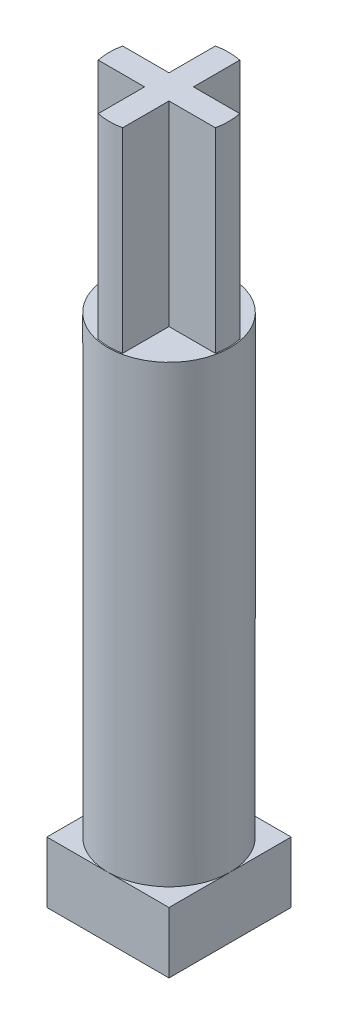
ISO-10303-21;
HEADER;
FILE_DESCRIPTION(('STEP AP214'),'2;1');
FILE_NAME('part.step','',(''),(''),'','','');
FILE_SCHEMA(('AUTOMOTIVE_DESIGN { 1 0 10303 214 1 1 1 1 }'));
ENDSEC;
DATA;
#1=APPLICATION_CONTEXT('core data for automotive mechanical design processes');
#2=APPLICATION_PROTOCOL_DEFINITION('international standard','automotive_design',2000,#1);
#3=PRODUCT_CONTEXT('',#1,'mechanical');
#4=PRODUCT('Part','Part','',(#3));
#5=PRODUCT_RELATED_PRODUCT_CATEGORY('part','',(#4));
#6=PRODUCT_DEFINITION_FORMATION('','',#4);
#7=PRODUCT_DEFINITION_CONTEXT('part definition',#1,'design');
#8=PRODUCT_DEFINITION('design','',#6,#7);
#9=PRODUCT_DEFINITION_SHAPE('','',#8);
#10=(LENGTH_UNIT() NAMED_UNIT(*) SI_UNIT(.MILLI.,.METRE.));
#11=(NAMED_UNIT(*) PLANE_ANGLE_UNIT() SI_UNIT($,.RADIAN.));
#12=(NAMED_UNIT(*) SI_UNIT($,.STERADIAN.) SOLID_ANGLE_UNIT());
#13=UNCERTAINTY_MEASURE_WITH_UNIT(LENGTH_MEASURE(1.E-05),#10,'distance_accuracy_value','');
#14=(GEOMETRIC_REPRESENTATION_CONTEXT(3) GLOBAL_UNCERTAINTY_ASSIGNED_CONTEXT((#13)) GLOBAL_UNIT_ASSIGNED_CONTEXT((#10,
#11,#12)) REPRESENTATION_CONTEXT('',''));
#15=CARTESIAN_POINT('',(0.,0.,0.));
#16=DIRECTION('',(0.,0.,1.));
#17=DIRECTION('',(1.,0.,0.));
#18=AXIS2_PLACEMENT_3D('',#15,#16,#17);
#19=CARTESIAN_POINT('',(-12.5274794228426,-8.79469865117993,26.9205972098226));
#20=DIRECTION('',(0.,1.,0.));
#21=DIRECTION('',(0.,0.,1.));
#22=AXIS2_PLACEMENT_3D('',#19,#20,#21);
#23=PLANE('',#22);
#24=CARTESIAN_POINT('',(-12.5274794228426,-8.79469865117993,26.9205972098226));
#25=DIRECTION('',(0.,1.,0.));
#26=DIRECTION('',(0.,0.,1.));
#27=AXIS2_PLACEMENT_3D('',#24,#25,#26);
#28=CIRCLE('',#27,2.5);
#29=CARTESIAN_POINT('',(-12.5274794228426,-8.79469865117993,29.4205972098226));
#30=VERTEX_POINT('',#29);
#31=EDGE_CURVE('E183',#30,#30,#28,.T.);
#32=ORIENTED_EDGE('',*,*,#31,.T.);
#33=EDGE_LOOP('',(#32));
#34=FACE_BOUND('',#33,.T.);
#35=DIRECTION('',(1.,0.,0.));
#36=VECTOR('',#35,1.);
#37=CARTESIAN_POINT('',(0.,-8.79469865117993,27.4205972098226));
#38=LINE('',#37,#36);
#39=CARTESIAN_POINT('',(-12.0274794228426,-8.79469865117993,27.4205972098226));
#40=VERTEX_POINT('',#39);
#41=CARTESIAN_POINT('',(-10.1290424318003,-8.79469865117993,27.4205972098226));
#42=VERTEX_POINT('',#41);
#43=EDGE_CURVE('E234',#40,#42,#38,.T.);
#44=ORIENTED_EDGE('',*,*,#43,.F.);
#45=DIRECTION('',(0.,0.,1.));
#46=VECTOR('',#45,1.);
#47=CARTESIAN_POINT('',(-12.0274794228426,-8.79469865117993,0.));
#48=LINE('',#47,#46);
#49=CARTESIAN_POINT('',(-12.0274794228426,-8.79469865117993,29.3190342008649));
#50=VERTEX_POINT('',#49);
#51=EDGE_CURVE('E66',#40,#50,#48,.T.);
#52=ORIENTED_EDGE('',*,*,#51,.T.);
#53=CARTESIAN_POINT('',(-12.5274794228426,-8.79469865117993,26.9205972098226));
#54=DIRECTION('',(0.,1.,0.));
#55=DIRECTION('',(0.,0.,1.));
#56=AXIS2_PLACEMENT_3D('',#53,#54,#55);
#57=CIRCLE('',#56,2.45);
#58=CARTESIAN_POINT('',(-13.0274794228426,-8.79469865117993,29.3190342008649));
#59=VERTEX_POINT('',#58);
#60=EDGE_CURVE('E71',#59,#50,#57,.T.);
#61=ORIENTED_EDGE('',*,*,#60,.F.);
#62=DIRECTION('',(0.,0.,1.));
#63=VECTOR('',#62,1.);
#64=CARTESIAN_POINT('',(-13.0274794228426,-8.79469865117993,0.));
#65=LINE('',#64,#63);
#66=CARTESIAN_POINT('',(-13.0274794228426,-8.79469865117993,27.4205972098226));
#67=VERTEX_POINT('',#66);
#68=EDGE_CURVE('E202',#67,#59,#65,.T.);
#69=ORIENTED_EDGE('',*,*,#68,.F.);
#70=DIRECTION('',(-1.,0.,0.));
#71=VECTOR('',#70,1.);
#72=CARTESIAN_POINT('',(0.,-8.79469865117993,27.4205972098226));
#73=LINE('',#72,#71);
#74=CARTESIAN_POINT('',(-14.9259164138849,-8.79469865117993,27.4205972098226));
#75=VERTEX_POINT('',#74);
#76=EDGE_CURVE('E254',#67,#75,#73,.T.);
#77=ORIENTED_EDGE('',*,*,#76,.T.);
#78=CARTESIAN_POINT('',(-14.9259164138849,-8.79469865117993,26.4205972098226));
#79=VERTEX_POINT('',#78);
#80=EDGE_CURVE('E204',#79,#75,#57,.T.);
#81=ORIENTED_EDGE('',*,*,#80,.F.);
#82=DIRECTION('',(-1.,0.,0.));
#83=VECTOR('',#82,1.);
#84=CARTESIAN_POINT('',(0.,-8.79469865117993,26.4205972098226));
#85=LINE('',#84,#83);
#86=CARTESIAN_POINT('',(-13.0274794228426,-8.79469865117993,26.4205972098226));
#87=VERTEX_POINT('',#86);
#88=EDGE_CURVE('E250',#87,#79,#85,.T.);
#89=ORIENTED_EDGE('',*,*,#88,.F.);
#90=DIRECTION('',(0.,0.,-1.));
#91=VECTOR('',#90,1.);
#92=CARTESIAN_POINT('',(-13.0274794228426,-8.79469865117993,0.));
#93=LINE('',#92,#91);
#94=CARTESIAN_POINT('',(-13.0274794228426,-8.79469865117993,24.5221602187803));
#95=VERTEX_POINT('',#94);
#96=EDGE_CURVE('E247',#87,#95,#93,.T.);
#97=ORIENTED_EDGE('',*,*,#96,.T.);
#98=CARTESIAN_POINT('',(-12.0274794228426,-8.79469865117993,24.5221602187803));
#99=VERTEX_POINT('',#98);
#100=EDGE_CURVE('E240',#99,#95,#57,.T.);
#101=ORIENTED_EDGE('',*,*,#100,.F.);
#102=DIRECTION('',(0.,0.,-1.));
#103=VECTOR('',#102,1.);
#104=CARTESIAN_POINT('',(-12.0274794228426,-8.79469865117993,0.));
#105=LINE('',#104,#103);
#106=CARTESIAN_POINT('',(-12.0274794228426,-8.79469865117993,26.4205972098226));
#107=VERTEX_POINT('',#106);
#108=EDGE_CURVE('E243',#107,#99,#105,.T.);
#109=ORIENTED_EDGE('',*,*,#108,.F.);
#110=DIRECTION('',(1.,0.,0.));
#111=VECTOR('',#110,1.);
#112=CARTESIAN_POINT('',(0.,-8.79469865117993,26.4205972098226));
#113=LINE('',#112,#111);
#114=CARTESIAN_POINT('',(-10.1290424318003,-8.79469865117993,26.4205972098226));
#115=VERTEX_POINT('',#114);
#116=EDGE_CURVE('E239',#107,#115,#113,.T.);
#117=ORIENTED_EDGE('',*,*,#116,.T.);
#118=EDGE_CURVE('E205',#42,#115,#57,.T.);
#119=ORIENTED_EDGE('',*,*,#118,.F.);
#120=EDGE_LOOP('',(#44,#52,#61,#69,#77,#81,#89,#97,#101,#109,#117,#119));
#121=FACE_BOUND('',#120,.T.);
#122=ADVANCED_FACE('F47',(#34,#121),#23,.T.);
#123=CARTESIAN_POINT('',(-12.5274794228426,-27.3946986511799,26.9205972098226));
#124=DIRECTION('',(0.,1.,0.));
#125=DIRECTION('',(0.,0.,1.));
#126=AXIS2_PLACEMENT_3D('',#123,#124,#125);
#127=PLANE('',#126);
#128=CARTESIAN_POINT('',(-12.5274794228426,-27.3946986511799,26.9205972098226));
#129=DIRECTION('',(0.,1.,0.));
#130=DIRECTION('',(0.,0.,1.));
#131=AXIS2_PLACEMENT_3D('',#128,#129,#130);
#132=CIRCLE('',#131,2.5);
#133=CARTESIAN_POINT('',(-12.5274794228426,-27.3946986511799,29.4205972098226));
#134=VERTEX_POINT('',#133);
#135=CARTESIAN_POINT('',(-10.0274794228426,-27.3946986511799,26.9205972098226));
#136=VERTEX_POINT('',#135);
#137=EDGE_CURVE('E59',#134,#136,#132,.T.);
#138=ORIENTED_EDGE('',*,*,#137,.F.);
#139=DIRECTION('',(1.,0.,0.));
#140=VECTOR('',#139,1.);
#141=CARTESIAN_POINT('',(-15.0274794228426,-27.3946986511799,29.4205972098226));
#142=LINE('',#141,#140);
#143=CARTESIAN_POINT('',(-10.0274794228426,-27.3946986511799,29.4205972098226));
#144=VERTEX_POINT('',#143);
#145=EDGE_CURVE('E311',#134,#144,#142,.T.);
#146=ORIENTED_EDGE('',*,*,#145,.T.);
#147=DIRECTION('',(0.,0.,-1.));
#148=VECTOR('',#147,1.);
#149=CARTESIAN_POINT('',(-10.0274794228426,-27.3946986511799,29.4205972098226));
#150=LINE('',#149,#148);
#151=EDGE_CURVE('E312',#144,#136,#150,.T.);
#152=ORIENTED_EDGE('',*,*,#151,.T.);
#153=EDGE_LOOP('',(#138,#146,#152));
#154=FACE_BOUND('',#153,.T.);
#155=ADVANCED_FACE('F430',(#154),#127,.T.);
#156=CARTESIAN_POINT('',(-12.5274794228426,-27.3946986511799,24.4205972098226));
#157=VERTEX_POINT('',#156);
#158=EDGE_CURVE('E11',#136,#157,#132,.T.);
#159=ORIENTED_EDGE('',*,*,#158,.F.);
#160=CARTESIAN_POINT('',(-10.0274794228426,-27.3946986511799,24.4205972098226));
#161=VERTEX_POINT('',#160);
#162=EDGE_CURVE('E310',#136,#161,#150,.T.);
#163=ORIENTED_EDGE('',*,*,#162,.T.);
#164=DIRECTION('',(1.,0.,0.));
#165=VECTOR('',#164,1.);
#166=CARTESIAN_POINT('',(-15.0274794228426,-27.3946986511799,24.4205972098226));
#167=LINE('',#166,#165);
#168=EDGE_CURVE('E316',#157,#161,#167,.T.);
#169=ORIENTED_EDGE('',*,*,#168,.F.);
#170=EDGE_LOOP('',(#159,#163,#169));
#171=FACE_BOUND('',#170,.T.);
#172=ADVANCED_FACE('F370',(#171),#127,.T.);
#173=CARTESIAN_POINT('',(-15.0274794228426,-27.3946986511799,26.9205972098226));
#174=VERTEX_POINT('',#173);
#175=EDGE_CURVE('E57',#157,#174,#132,.T.);
#176=ORIENTED_EDGE('',*,*,#175,.F.);
#177=CARTESIAN_POINT('',(-15.0274794228426,-27.3946986511799,24.4205972098226));
#178=VERTEX_POINT('',#177);
#179=EDGE_CURVE('E317',#178,#157,#167,.T.);
#180=ORIENTED_EDGE('',*,*,#179,.F.);
#181=DIRECTION('',(0.,0.,-1.));
#182=VECTOR('',#181,1.);
#183=CARTESIAN_POINT('',(-15.0274794228426,-27.3946986511799,29.4205972098226));
#184=LINE('',#183,#182);
#185=EDGE_CURVE('E321',#174,#178,#184,.T.);
#186=ORIENTED_EDGE('',*,*,#185,.F.);
#187=EDGE_LOOP('',(#176,#180,#186));
#188=FACE_BOUND('',#187,.T.);
#189=ADVANCED_FACE('F367',(#188),#127,.T.);
#190=CARTESIAN_POINT('',(-15.0274794228426,-27.3946986511799,29.4205972098226));
#191=DIRECTION('',(0.,0.,-1.));
#192=DIRECTION('',(-1.,0.,0.));
#193=AXIS2_PLACEMENT_3D('',#190,#191,#192);
#194=PLANE('',#193);
#195=DIRECTION('',(1.,0.,0.));
#196=VECTOR('',#195,1.);
#197=CARTESIAN_POINT('',(-15.0274794228426,-29.8946986511799,29.4205972098226));
#198=LINE('',#197,#196);
#199=CARTESIAN_POINT('',(-15.0274794228426,-29.8946986511799,29.4205972098226));
#200=VERTEX_POINT('',#199);
#201=CARTESIAN_POINT('',(-10.0274794228426,-29.8946986511799,29.4205972098226));
#202=VERTEX_POINT('',#201);
#203=EDGE_CURVE('E305',#200,#202,#198,.T.);
#204=ORIENTED_EDGE('',*,*,#203,.T.);
#205=DIRECTION('',(0.,-1.,0.));
#206=VECTOR('',#205,1.);
#207=CARTESIAN_POINT('',(-10.0274794228426,-27.3946986511799,29.4205972098226));
#208=LINE('',#207,#206);
#209=EDGE_CURVE('E51',#144,#202,#208,.T.);
#210=ORIENTED_EDGE('',*,*,#209,.F.);
#211=ORIENTED_EDGE('',*,*,#145,.F.);
#212=CARTESIAN_POINT('',(-15.0274794228426,-27.3946986511799,29.4205972098226));
#213=VERTEX_POINT('',#212);
#214=EDGE_CURVE('E307',#213,#134,#142,.T.);
#215=ORIENTED_EDGE('',*,*,#214,.F.);
#216=DIRECTION('',(0.,-1.,0.));
#217=VECTOR('',#216,1.);
#218=CARTESIAN_POINT('',(-15.0274794228426,-27.3946986511799,29.4205972098226));
#219=LINE('',#218,#217);
#220=EDGE_CURVE('E326',#213,#200,#219,.T.);
#221=ORIENTED_EDGE('',*,*,#220,.T.);
#222=EDGE_LOOP('',(#204,#210,#211,#215,#221));
#223=FACE_BOUND('',#222,.T.);
#224=ADVANCED_FACE('F49',(#223),#194,.F.);
#225=CARTESIAN_POINT('',(-10.0274794228426,-27.3946986511799,29.4205972098226));
#226=DIRECTION('',(-1.,0.,0.));
#227=DIRECTION('',(0.,0.,1.));
#228=AXIS2_PLACEMENT_3D('',#225,#226,#227);
#229=PLANE('',#228);
#230=DIRECTION('',(0.,0.,-1.));
#231=VECTOR('',#230,1.);
#232=CARTESIAN_POINT('',(-10.0274794228426,-29.8946986511799,29.4205972098226));
#233=LINE('',#232,#231);
#234=CARTESIAN_POINT('',(-10.0274794228426,-29.8946986511799,24.4205972098226));
#235=VERTEX_POINT('',#234);
#236=EDGE_CURVE('E330',#202,#235,#233,.T.);
#237=ORIENTED_EDGE('',*,*,#236,.T.);
#238=DIRECTION('',(0.,-1.,0.));
#239=VECTOR('',#238,1.);
#240=CARTESIAN_POINT('',(-10.0274794228426,-27.3946986511799,24.4205972098226));
#241=LINE('',#240,#239);
#242=EDGE_CURVE('E346',#161,#235,#241,.T.);
#243=ORIENTED_EDGE('',*,*,#242,.F.);
#244=ORIENTED_EDGE('',*,*,#162,.F.);
#245=ORIENTED_EDGE('',*,*,#151,.F.);
#246=ORIENTED_EDGE('',*,*,#209,.T.);
#247=EDGE_LOOP('',(#237,#243,#244,#245,#246));
#248=FACE_BOUND('',#247,.T.);
#249=ADVANCED_FACE('F453',(#248),#229,.F.);
#250=CARTESIAN_POINT('',(-15.0274794228426,-27.3946986511799,24.4205972098226));
#251=DIRECTION('',(0.,0.,-1.));
#252=DIRECTION('',(-1.,0.,0.));
#253=AXIS2_PLACEMENT_3D('',#250,#251,#252);
#254=PLANE('',#253);
#255=DIRECTION('',(1.,0.,0.));
#256=VECTOR('',#255,1.);
#257=CARTESIAN_POINT('',(-15.0274794228426,-29.8946986511799,24.4205972098226));
#258=LINE('',#257,#256);
#259=CARTESIAN_POINT('',(-15.0274794228426,-29.8946986511799,24.4205972098226));
#260=VERTEX_POINT('',#259);
#261=EDGE_CURVE('E334',#260,#235,#258,.T.);
#262=ORIENTED_EDGE('',*,*,#261,.F.);
#263=DIRECTION('',(0.,-1.,0.));
#264=VECTOR('',#263,1.);
#265=CARTESIAN_POINT('',(-15.0274794228426,-27.3946986511799,24.4205972098226));
#266=LINE('',#265,#264);
#267=EDGE_CURVE('E344',#178,#260,#266,.T.);
#268=ORIENTED_EDGE('',*,*,#267,.F.);
#269=ORIENTED_EDGE('',*,*,#179,.T.);
#270=ORIENTED_EDGE('',*,*,#168,.T.);
#271=ORIENTED_EDGE('',*,*,#242,.T.);
#272=EDGE_LOOP('',(#262,#268,#269,#270,#271));
#273=FACE_BOUND('',#272,.T.);
#274=ADVANCED_FACE('F374',(#273),#254,.T.);
#275=CARTESIAN_POINT('',(-15.0274794228426,-27.3946986511799,29.4205972098226));
#276=DIRECTION('',(-1.,0.,0.));
#277=DIRECTION('',(0.,0.,1.));
#278=AXIS2_PLACEMENT_3D('',#275,#276,#277);
#279=PLANE('',#278);
#280=DIRECTION('',(0.,0.,-1.));
#281=VECTOR('',#280,1.);
#282=CARTESIAN_POINT('',(-15.0274794228426,-29.8946986511799,29.4205972098226));
#283=LINE('',#282,#281);
#284=EDGE_CURVE('E338',#200,#260,#283,.T.);
#285=ORIENTED_EDGE('',*,*,#284,.F.);
#286=ORIENTED_EDGE('',*,*,#220,.F.);
#287=EDGE_CURVE('E322',#213,#174,#184,.T.);
#288=ORIENTED_EDGE('',*,*,#287,.T.);
#289=ORIENTED_EDGE('',*,*,#185,.T.);
#290=ORIENTED_EDGE('',*,*,#267,.T.);
#291=EDGE_LOOP('',(#285,#286,#288,#289,#290));
#292=FACE_BOUND('',#291,.T.);
#293=ADVANCED_FACE('F377',(#292),#279,.T.);
#294=EDGE_CURVE('E306',#174,#134,#132,.T.);
#295=ORIENTED_EDGE('',*,*,#294,.F.);
#296=ORIENTED_EDGE('',*,*,#287,.F.);
#297=ORIENTED_EDGE('',*,*,#214,.T.);
#298=EDGE_LOOP('',(#295,#296,#297));
#299=FACE_BOUND('',#298,.T.);
#300=ADVANCED_FACE('F438',(#299),#127,.T.);
#301=CARTESIAN_POINT('',(-12.5274794228426,-29.8946986511799,26.9205972098226));
#302=DIRECTION('',(0.,1.,0.));
#303=DIRECTION('',(0.,0.,1.));
#304=AXIS2_PLACEMENT_3D('',#301,#302,#303);
#305=PLANE('',#304);
#306=ORIENTED_EDGE('',*,*,#203,.F.);
#307=ORIENTED_EDGE('',*,*,#284,.T.);
#308=ORIENTED_EDGE('',*,*,#261,.T.);
#309=ORIENTED_EDGE('',*,*,#236,.F.);
#310=EDGE_LOOP('',(#306,#307,#308,#309));
#311=FACE_BOUND('',#310,.T.);
#312=ADVANCED_FACE('F443',(#311),#305,.F.);
#313=CARTESIAN_POINT('',(-12.5274794228426,-9.79469865117993,26.9205972098226));
#314=DIRECTION('',(0.,-1.,0.));
#315=DIRECTION('',(0.,0.,-1.));
#316=AXIS2_PLACEMENT_3D('',#313,#314,#315);
#317=CYLINDRICAL_SURFACE('',#316,2.5);
#318=ORIENTED_EDGE('',*,*,#137,.T.);
#319=ORIENTED_EDGE('',*,*,#158,.T.);
#320=ORIENTED_EDGE('',*,*,#175,.T.);
#321=ORIENTED_EDGE('',*,*,#294,.T.);
#322=EDGE_LOOP('',(#318,#319,#320,#321));
#323=FACE_BOUND('',#322,.T.);
#324=ORIENTED_EDGE('',*,*,#31,.F.);
#325=EDGE_LOOP('',(#324));
#326=FACE_BOUND('',#325,.T.);
#327=ADVANCED_FACE('F361',(#323,#326),#317,.T.);
#328=CARTESIAN_POINT('',(-12.0274794228426,-0.794698651179926,0.));
#329=DIRECTION('',(1.,0.,0.));
#330=DIRECTION('',(0.,0.,-1.));
#331=AXIS2_PLACEMENT_3D('',#328,#329,#330);
#332=PLANE('',#331);
#333=ORIENTED_EDGE('',*,*,#51,.F.);
#334=DIRECTION('',(0.,-1.,0.));
#335=VECTOR('',#334,1.);
#336=CARTESIAN_POINT('',(-12.0274794228426,-0.794698651179926,27.4205972098226));
#337=LINE('',#336,#335);
#338=CARTESIAN_POINT('',(-12.0274794228426,-0.794698651179926,27.4205972098226));
#339=VERTEX_POINT('',#338);
#340=EDGE_CURVE('E175',#339,#40,#337,.T.);
#341=ORIENTED_EDGE('',*,*,#340,.F.);
#342=DIRECTION('',(0.,0.,1.));
#343=VECTOR('',#342,1.);
#344=CARTESIAN_POINT('',(-12.0274794228426,-0.794698651179926,0.));
#345=LINE('',#344,#343);
#346=CARTESIAN_POINT('',(-12.0274794228426,-0.794698651179926,29.3190342008649));
#347=VERTEX_POINT('',#346);
#348=EDGE_CURVE('E179',#339,#347,#345,.T.);
#349=ORIENTED_EDGE('',*,*,#348,.T.);
#350=DIRECTION('',(0.,-1.,0.));
#351=VECTOR('',#350,1.);
#352=CARTESIAN_POINT('',(-12.0274794228426,-0.794698651179926,29.3190342008649));
#353=LINE('',#352,#351);
#354=EDGE_CURVE('E259',#347,#50,#353,.T.);
#355=ORIENTED_EDGE('',*,*,#354,.T.);
#356=EDGE_LOOP('',(#333,#341,#349,#355));
#357=FACE_BOUND('',#356,.T.);
#358=ADVANCED_FACE('F177',(#357),#332,.T.);
#359=CARTESIAN_POINT('',(0.,-0.794698651179926,27.4205972098226));
#360=DIRECTION('',(0.,0.,-1.));
#361=DIRECTION('',(-1.,0.,0.));
#362=AXIS2_PLACEMENT_3D('',#359,#360,#361);
#363=PLANE('',#362);
#364=ORIENTED_EDGE('',*,*,#43,.T.);
#365=DIRECTION('',(0.,-1.,0.));
#366=VECTOR('',#365,1.);
#367=CARTESIAN_POINT('',(-10.1290424318003,-0.794698651179926,27.4205972098226));
#368=LINE('',#367,#366);
#369=CARTESIAN_POINT('',(-10.1290424318003,-0.794698651179926,27.4205972098226));
#370=VERTEX_POINT('',#369);
#371=EDGE_CURVE('E184',#370,#42,#368,.T.);
#372=ORIENTED_EDGE('',*,*,#371,.F.);
#373=DIRECTION('',(1.,0.,0.));
#374=VECTOR('',#373,1.);
#375=CARTESIAN_POINT('',(0.,-0.794698651179926,27.4205972098226));
#376=LINE('',#375,#374);
#377=EDGE_CURVE('E187',#339,#370,#376,.T.);
#378=ORIENTED_EDGE('',*,*,#377,.F.);
#379=ORIENTED_EDGE('',*,*,#340,.T.);
#380=EDGE_LOOP('',(#364,#372,#378,#379));
#381=FACE_BOUND('',#380,.T.);
#382=ADVANCED_FACE('F188',(#381),#363,.F.);
#383=CARTESIAN_POINT('',(-12.5274794228426,-0.794698651179926,26.9205972098226));
#384=DIRECTION('',(0.,-1.,0.));
#385=DIRECTION('',(0.,0.,-1.));
#386=AXIS2_PLACEMENT_3D('',#383,#384,#385);
#387=CYLINDRICAL_SURFACE('',#386,2.45);
#388=ORIENTED_EDGE('',*,*,#118,.T.);
#389=DIRECTION('',(0.,-1.,0.));
#390=VECTOR('',#389,1.);
#391=CARTESIAN_POINT('',(-10.1290424318003,-0.794698651179926,26.4205972098226));
#392=LINE('',#391,#390);
#393=CARTESIAN_POINT('',(-10.1290424318003,-0.794698651179926,26.4205972098226));
#394=VERTEX_POINT('',#393);
#395=EDGE_CURVE('E294',#394,#115,#392,.T.);
#396=ORIENTED_EDGE('',*,*,#395,.F.);
#397=CARTESIAN_POINT('',(-12.5274794228426,-0.794698651179926,26.9205972098226));
#398=DIRECTION('',(0.,1.,0.));
#399=DIRECTION('',(0.,0.,1.));
#400=AXIS2_PLACEMENT_3D('',#397,#398,#399);
#401=CIRCLE('',#400,2.45);
#402=EDGE_CURVE('E193',#370,#394,#401,.T.);
#403=ORIENTED_EDGE('',*,*,#402,.F.);
#404=ORIENTED_EDGE('',*,*,#371,.T.);
#405=EDGE_LOOP('',(#388,#396,#403,#404));
#406=FACE_BOUND('',#405,.T.);
#407=ADVANCED_FACE('F418',(#406),#387,.T.);
#408=CARTESIAN_POINT('',(0.,-0.794698651179926,26.4205972098226));
#409=DIRECTION('',(0.,0.,-1.));
#410=DIRECTION('',(-1.,0.,0.));
#411=AXIS2_PLACEMENT_3D('',#408,#409,#410);
#412=PLANE('',#411);
#413=ORIENTED_EDGE('',*,*,#116,.F.);
#414=DIRECTION('',(0.,-1.,0.));
#415=VECTOR('',#414,1.);
#416=CARTESIAN_POINT('',(-12.0274794228426,-0.794698651179926,26.4205972098226));
#417=LINE('',#416,#415);
#418=CARTESIAN_POINT('',(-12.0274794228426,-0.794698651179926,26.4205972098226));
#419=VERTEX_POINT('',#418);
#420=EDGE_CURVE('E290',#419,#107,#417,.T.);
#421=ORIENTED_EDGE('',*,*,#420,.F.);
#422=DIRECTION('',(1.,0.,0.));
#423=VECTOR('',#422,1.);
#424=CARTESIAN_POINT('',(0.,-0.794698651179926,26.4205972098226));
#425=LINE('',#424,#423);
#426=EDGE_CURVE('E209',#419,#394,#425,.T.);
#427=ORIENTED_EDGE('',*,*,#426,.T.);
#428=ORIENTED_EDGE('',*,*,#395,.T.);
#429=EDGE_LOOP('',(#413,#421,#427,#428));
#430=FACE_BOUND('',#429,.T.);
#431=ADVANCED_FACE('F426',(#430),#412,.T.);
#432=CARTESIAN_POINT('',(-12.0274794228426,-0.794698651179926,0.));
#433=DIRECTION('',(-1.,0.,0.));
#434=DIRECTION('',(0.,0.,1.));
#435=AXIS2_PLACEMENT_3D('',#432,#433,#434);
#436=PLANE('',#435);
#437=ORIENTED_EDGE('',*,*,#108,.T.);
#438=DIRECTION('',(0.,-1.,0.));
#439=VECTOR('',#438,1.);
#440=CARTESIAN_POINT('',(-12.0274794228426,-0.794698651179926,24.5221602187803));
#441=LINE('',#440,#439);
#442=CARTESIAN_POINT('',(-12.0274794228426,-0.794698651179926,24.5221602187803));
#443=VERTEX_POINT('',#442);
#444=EDGE_CURVE('E286',#443,#99,#441,.T.);
#445=ORIENTED_EDGE('',*,*,#444,.F.);
#446=DIRECTION('',(0.,0.,-1.));
#447=VECTOR('',#446,1.);
#448=CARTESIAN_POINT('',(-12.0274794228426,-0.794698651179926,0.));
#449=LINE('',#448,#447);
#450=EDGE_CURVE('E214',#419,#443,#449,.T.);
#451=ORIENTED_EDGE('',*,*,#450,.F.);
#452=ORIENTED_EDGE('',*,*,#420,.T.);
#453=EDGE_LOOP('',(#437,#445,#451,#452));
#454=FACE_BOUND('',#453,.T.);
#455=ADVANCED_FACE('F576',(#454),#436,.F.);
#456=ORIENTED_EDGE('',*,*,#100,.T.);
#457=DIRECTION('',(0.,-1.,0.));
#458=VECTOR('',#457,1.);
#459=CARTESIAN_POINT('',(-13.0274794228426,-0.794698651179926,24.5221602187803));
#460=LINE('',#459,#458);
#461=CARTESIAN_POINT('',(-13.0274794228426,-0.794698651179926,24.5221602187803));
#462=VERTEX_POINT('',#461);
#463=EDGE_CURVE('E282',#462,#95,#460,.T.);
#464=ORIENTED_EDGE('',*,*,#463,.F.);
#465=EDGE_CURVE('E210',#443,#462,#401,.T.);
#466=ORIENTED_EDGE('',*,*,#465,.F.);
#467=ORIENTED_EDGE('',*,*,#444,.T.);
#468=EDGE_LOOP('',(#456,#464,#466,#467));
#469=FACE_BOUND('',#468,.T.);
#470=ADVANCED_FACE('F393',(#469),#387,.T.);
#471=CARTESIAN_POINT('',(-13.0274794228426,-0.794698651179926,0.));
#472=DIRECTION('',(-1.,0.,0.));
#473=DIRECTION('',(0.,0.,1.));
#474=AXIS2_PLACEMENT_3D('',#471,#472,#473);
#475=PLANE('',#474);
#476=ORIENTED_EDGE('',*,*,#96,.F.);
#477=DIRECTION('',(0.,-1.,0.));
#478=VECTOR('',#477,1.);
#479=CARTESIAN_POINT('',(-13.0274794228426,-0.794698651179926,26.4205972098226));
#480=LINE('',#479,#478);
#481=CARTESIAN_POINT('',(-13.0274794228426,-0.794698651179926,26.4205972098226));
#482=VERTEX_POINT('',#481);
#483=EDGE_CURVE('E278',#482,#87,#480,.T.);
#484=ORIENTED_EDGE('',*,*,#483,.F.);
#485=DIRECTION('',(0.,0.,-1.));
#486=VECTOR('',#485,1.);
#487=CARTESIAN_POINT('',(-13.0274794228426,-0.794698651179926,0.));
#488=LINE('',#487,#486);
#489=EDGE_CURVE('E217',#482,#462,#488,.T.);
#490=ORIENTED_EDGE('',*,*,#489,.T.);
#491=ORIENTED_EDGE('',*,*,#463,.T.);
#492=EDGE_LOOP('',(#476,#484,#490,#491));
#493=FACE_BOUND('',#492,.T.);
#494=ADVANCED_FACE('F396',(#493),#475,.T.);
#495=CARTESIAN_POINT('',(0.,-0.794698651179926,26.4205972098226));
#496=DIRECTION('',(0.,0.,1.));
#497=DIRECTION('',(1.,0.,0.));
#498=AXIS2_PLACEMENT_3D('',#495,#496,#497);
#499=PLANE('',#498);
#500=ORIENTED_EDGE('',*,*,#88,.T.);
#501=DIRECTION('',(0.,-1.,0.));
#502=VECTOR('',#501,1.);
#503=CARTESIAN_POINT('',(-14.9259164138849,-0.794698651179926,26.4205972098226));
#504=LINE('',#503,#502);
#505=CARTESIAN_POINT('',(-14.9259164138849,-0.794698651179926,26.4205972098226));
#506=VERTEX_POINT('',#505);
#507=EDGE_CURVE('E274',#506,#79,#504,.T.);
#508=ORIENTED_EDGE('',*,*,#507,.F.);
#509=DIRECTION('',(-1.,0.,0.));
#510=VECTOR('',#509,1.);
#511=CARTESIAN_POINT('',(0.,-0.794698651179926,26.4205972098226));
#512=LINE('',#511,#510);
#513=EDGE_CURVE('E221',#482,#506,#512,.T.);
#514=ORIENTED_EDGE('',*,*,#513,.F.);
#515=ORIENTED_EDGE('',*,*,#483,.T.);
#516=EDGE_LOOP('',(#500,#508,#514,#515));
#517=FACE_BOUND('',#516,.T.);
#518=ADVANCED_FACE('F400',(#517),#499,.F.);
#519=ORIENTED_EDGE('',*,*,#80,.T.);
#520=DIRECTION('',(0.,-1.,0.));
#521=VECTOR('',#520,1.);
#522=CARTESIAN_POINT('',(-14.9259164138849,-0.794698651179926,27.4205972098226));
#523=LINE('',#522,#521);
#524=CARTESIAN_POINT('',(-14.9259164138849,-0.794698651179926,27.4205972098226));
#525=VERTEX_POINT('',#524);
#526=EDGE_CURVE('E270',#525,#75,#523,.T.);
#527=ORIENTED_EDGE('',*,*,#526,.F.);
#528=EDGE_CURVE('E224',#506,#525,#401,.T.);
#529=ORIENTED_EDGE('',*,*,#528,.F.);
#530=ORIENTED_EDGE('',*,*,#507,.T.);
#531=EDGE_LOOP('',(#519,#527,#529,#530));
#532=FACE_BOUND('',#531,.T.);
#533=ADVANCED_FACE('F406',(#532),#387,.T.);
#534=CARTESIAN_POINT('',(0.,-0.794698651179926,27.4205972098226));
#535=DIRECTION('',(0.,0.,1.));
#536=DIRECTION('',(1.,0.,0.));
#537=AXIS2_PLACEMENT_3D('',#534,#535,#536);
#538=PLANE('',#537);
#539=ORIENTED_EDGE('',*,*,#76,.F.);
#540=DIRECTION('',(0.,-1.,0.));
#541=VECTOR('',#540,1.);
#542=CARTESIAN_POINT('',(-13.0274794228426,-0.794698651179926,27.4205972098226));
#543=LINE('',#542,#541);
#544=CARTESIAN_POINT('',(-13.0274794228426,-0.794698651179926,27.4205972098226));
#545=VERTEX_POINT('',#544);
#546=EDGE_CURVE('E266',#545,#67,#543,.T.);
#547=ORIENTED_EDGE('',*,*,#546,.F.);
#548=DIRECTION('',(-1.,0.,0.));
#549=VECTOR('',#548,1.);
#550=CARTESIAN_POINT('',(0.,-0.794698651179926,27.4205972098226));
#551=LINE('',#550,#549);
#552=EDGE_CURVE('E225',#545,#525,#551,.T.);
#553=ORIENTED_EDGE('',*,*,#552,.T.);
#554=ORIENTED_EDGE('',*,*,#526,.T.);
#555=EDGE_LOOP('',(#539,#547,#553,#554));
#556=FACE_BOUND('',#555,.T.);
#557=ADVANCED_FACE('F409',(#556),#538,.T.);
#558=CARTESIAN_POINT('',(-13.0274794228426,-0.794698651179926,0.));
#559=DIRECTION('',(1.,0.,0.));
#560=DIRECTION('',(0.,0.,-1.));
#561=AXIS2_PLACEMENT_3D('',#558,#559,#560);
#562=PLANE('',#561);
#563=ORIENTED_EDGE('',*,*,#68,.T.);
#564=DIRECTION('',(0.,-1.,0.));
#565=VECTOR('',#564,1.);
#566=CARTESIAN_POINT('',(-13.0274794228426,-0.794698651179926,29.3190342008649));
#567=LINE('',#566,#565);
#568=CARTESIAN_POINT('',(-13.0274794228426,-0.794698651179926,29.3190342008649));
#569=VERTEX_POINT('',#568);
#570=EDGE_CURVE('E262',#569,#59,#567,.T.);
#571=ORIENTED_EDGE('',*,*,#570,.F.);
#572=DIRECTION('',(0.,0.,1.));
#573=VECTOR('',#572,1.);
#574=CARTESIAN_POINT('',(-13.0274794228426,-0.794698651179926,0.));
#575=LINE('',#574,#573);
#576=EDGE_CURVE('E229',#545,#569,#575,.T.);
#577=ORIENTED_EDGE('',*,*,#576,.F.);
#578=ORIENTED_EDGE('',*,*,#546,.T.);
#579=EDGE_LOOP('',(#563,#571,#577,#578));
#580=FACE_BOUND('',#579,.T.);
#581=ADVANCED_FACE('F413',(#580),#562,.F.);
#582=ORIENTED_EDGE('',*,*,#60,.T.);
#583=ORIENTED_EDGE('',*,*,#354,.F.);
#584=EDGE_CURVE('E197',#569,#347,#401,.T.);
#585=ORIENTED_EDGE('',*,*,#584,.F.);
#586=ORIENTED_EDGE('',*,*,#570,.T.);
#587=EDGE_LOOP('',(#582,#583,#585,#586));
#588=FACE_BOUND('',#587,.T.);
#589=ADVANCED_FACE('F415',(#588),#387,.T.);
#590=CARTESIAN_POINT('',(0.,-0.794698651179926,0.));
#591=DIRECTION('',(0.,1.,0.));
#592=DIRECTION('',(0.,0.,1.));
#593=AXIS2_PLACEMENT_3D('',#590,#591,#592);
#594=PLANE('',#593);
#595=ORIENTED_EDGE('',*,*,#348,.F.);
#596=ORIENTED_EDGE('',*,*,#377,.T.);
#597=ORIENTED_EDGE('',*,*,#402,.T.);
#598=ORIENTED_EDGE('',*,*,#426,.F.);
#599=ORIENTED_EDGE('',*,*,#450,.T.);
#600=ORIENTED_EDGE('',*,*,#465,.T.);
#601=ORIENTED_EDGE('',*,*,#489,.F.);
#602=ORIENTED_EDGE('',*,*,#513,.T.);
#603=ORIENTED_EDGE('',*,*,#528,.T.);
#604=ORIENTED_EDGE('',*,*,#552,.F.);
#605=ORIENTED_EDGE('',*,*,#576,.T.);
#606=ORIENTED_EDGE('',*,*,#584,.T.);
#607=EDGE_LOOP('',(#595,#596,#597,#598,#599,#600,#601,#602,#603,#604,#605,#606));
#608=FACE_BOUND('',#607,.T.);
#609=ADVANCED_FACE('F195',(#608),#594,.T.);
#610=CLOSED_SHELL('',(#122,#155,#172,#189,#224,#249,#274,#293,#300,#312,#327,#358,#382,#407,
#431,#455,#470,#494,#518,#533,#557,#581,#589,#609));
#611=MANIFOLD_SOLID_BREP('B2',#610);
#612=ADVANCED_BREP_SHAPE_REPRESENTATION('',(#18,#611),#14);
#613=SHAPE_DEFINITION_REPRESENTATION(#9,#612);
ENDSEC;
END-ISO-10303-21;
